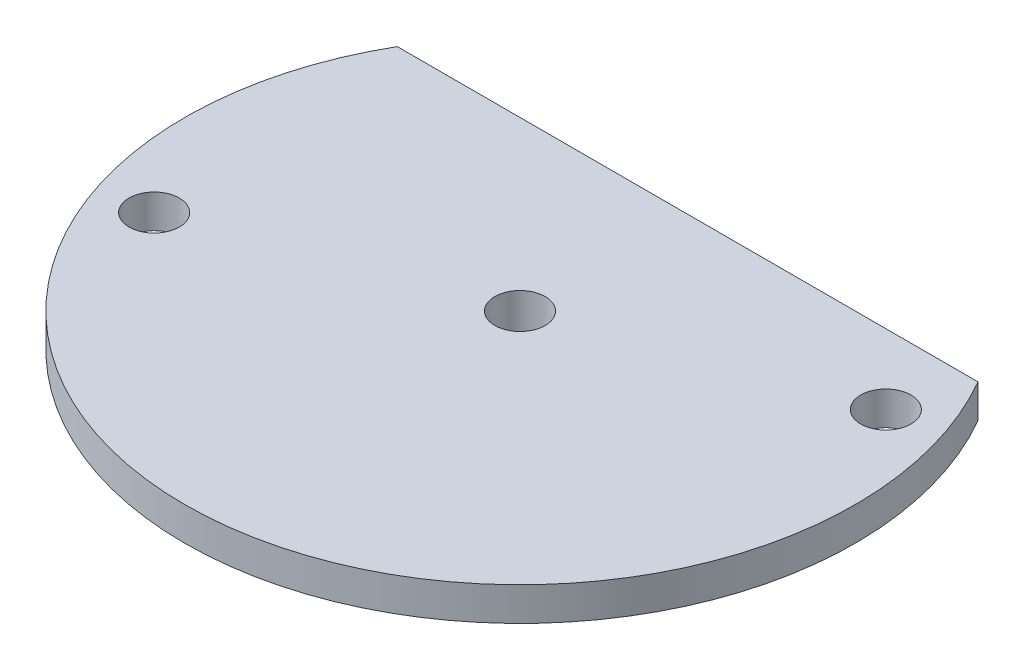
ISO-10303-21;
HEADER;
FILE_DESCRIPTION(('STEP AP214'),'2;1');
FILE_NAME('part.step','',(''),(''),'','','');
FILE_SCHEMA(('AUTOMOTIVE_DESIGN { 1 0 10303 214 1 1 1 1 }'));
ENDSEC;
DATA;
#1=APPLICATION_CONTEXT('core data for automotive mechanical design processes');
#2=APPLICATION_PROTOCOL_DEFINITION('international standard','automotive_design',2000,#1);
#3=PRODUCT_CONTEXT('',#1,'mechanical');
#4=PRODUCT('Part','Part','',(#3));
#5=PRODUCT_RELATED_PRODUCT_CATEGORY('part','',(#4));
#6=PRODUCT_DEFINITION_FORMATION('','',#4);
#7=PRODUCT_DEFINITION_CONTEXT('part definition',#1,'design');
#8=PRODUCT_DEFINITION('design','',#6,#7);
#9=PRODUCT_DEFINITION_SHAPE('','',#8);
#10=(LENGTH_UNIT() NAMED_UNIT(*) SI_UNIT(.MILLI.,.METRE.));
#11=(NAMED_UNIT(*) PLANE_ANGLE_UNIT() SI_UNIT($,.RADIAN.));
#12=(NAMED_UNIT(*) SI_UNIT($,.STERADIAN.) SOLID_ANGLE_UNIT());
#13=UNCERTAINTY_MEASURE_WITH_UNIT(LENGTH_MEASURE(1.E-05),#10,'distance_accuracy_value','');
#14=(GEOMETRIC_REPRESENTATION_CONTEXT(3) GLOBAL_UNCERTAINTY_ASSIGNED_CONTEXT((#13)) GLOBAL_UNIT_ASSIGNED_CONTEXT((#10,
#11,#12)) REPRESENTATION_CONTEXT('',''));
#15=CARTESIAN_POINT('',(0.,0.,0.));
#16=DIRECTION('',(0.,0.,1.));
#17=DIRECTION('',(1.,0.,0.));
#18=AXIS2_PLACEMENT_3D('',#15,#16,#17);
#19=CARTESIAN_POINT('',(0.,2.,0.));
#20=DIRECTION('',(0.,1.,0.));
#21=DIRECTION('',(0.,0.,1.));
#22=AXIS2_PLACEMENT_3D('',#19,#20,#21);
#23=PLANE('',#22);
#24=CARTESIAN_POINT('',(0.,2.,0.));
#25=DIRECTION('',(0.,1.,0.));
#26=DIRECTION('',(0.,0.,1.));
#27=AXIS2_PLACEMENT_3D('',#24,#25,#26);
#28=CIRCLE('',#27,1.5);
#29=CARTESIAN_POINT('',(0.,2.,1.5));
#30=VERTEX_POINT('',#29);
#31=EDGE_CURVE('E46',#30,#30,#28,.T.);
#32=ORIENTED_EDGE('',*,*,#31,.F.);
#33=EDGE_LOOP('',(#32));
#34=FACE_BOUND('',#33,.T.);
#35=CARTESIAN_POINT('',(-16.,2.,5.82352374825925));
#36=DIRECTION('',(0.,1.,0.));
#37=DIRECTION('',(0.,0.,1.));
#38=AXIS2_PLACEMENT_3D('',#35,#36,#37);
#39=CIRCLE('',#38,1.5);
#40=CARTESIAN_POINT('',(-16.,2.,7.32352374825925));
#41=VERTEX_POINT('',#40);
#42=EDGE_CURVE('E81',#41,#41,#39,.T.);
#43=ORIENTED_EDGE('',*,*,#42,.F.);
#44=EDGE_LOOP('',(#43));
#45=FACE_BOUND('',#44,.T.);
#46=CARTESIAN_POINT('',(0.,2.,0.));
#47=DIRECTION('',(0.,1.,0.));
#48=DIRECTION('',(0.,0.,1.));
#49=AXIS2_PLACEMENT_3D('',#46,#47,#48);
#50=CIRCLE('',#49,20.);
#51=CARTESIAN_POINT('',(-17.3205080756888,2.,-10.));
#52=VERTEX_POINT('',#51);
#53=CARTESIAN_POINT('',(17.3205080756888,2.,-10.));
#54=VERTEX_POINT('',#53);
#55=EDGE_CURVE('E74',#52,#54,#50,.T.);
#56=ORIENTED_EDGE('',*,*,#55,.T.);
#57=DIRECTION('',(-1.,0.,0.));
#58=VECTOR('',#57,1.);
#59=CARTESIAN_POINT('',(-17.3205080756888,2.,-10.));
#60=LINE('',#59,#58);
#61=EDGE_CURVE('E59',#54,#52,#60,.T.);
#62=ORIENTED_EDGE('',*,*,#61,.T.);
#63=EDGE_LOOP('',(#56,#62));
#64=FACE_BOUND('',#63,.T.);
#65=CARTESIAN_POINT('',(16.,2.,-5.82352374825925));
#66=DIRECTION('',(0.,1.,0.));
#67=DIRECTION('',(0.,0.,1.));
#68=AXIS2_PLACEMENT_3D('',#65,#66,#67);
#69=CIRCLE('',#68,1.5);
#70=CARTESIAN_POINT('',(16.,2.,-4.32352374825925));
#71=VERTEX_POINT('',#70);
#72=EDGE_CURVE('E90',#71,#71,#69,.T.);
#73=ORIENTED_EDGE('',*,*,#72,.F.);
#74=EDGE_LOOP('',(#73));
#75=FACE_BOUND('',#74,.T.);
#76=ADVANCED_FACE('F42',(#34,#45,#64,#75),#23,.T.);
#77=CARTESIAN_POINT('',(0.,0.,0.));
#78=DIRECTION('',(0.,1.,0.));
#79=DIRECTION('',(0.,0.,1.));
#80=AXIS2_PLACEMENT_3D('',#77,#78,#79);
#81=PLANE('',#80);
#82=CARTESIAN_POINT('',(0.,0.,0.));
#83=DIRECTION('',(0.,1.,0.));
#84=DIRECTION('',(0.,0.,1.));
#85=AXIS2_PLACEMENT_3D('',#82,#83,#84);
#86=CIRCLE('',#85,3.);
#87=CARTESIAN_POINT('',(0.,0.,3.));
#88=VERTEX_POINT('',#87);
#89=EDGE_CURVE('E98',#88,#88,#86,.T.);
#90=ORIENTED_EDGE('',*,*,#89,.T.);
#91=EDGE_LOOP('',(#90));
#92=FACE_BOUND('',#91,.T.);
#93=CARTESIAN_POINT('',(0.,0.,0.));
#94=DIRECTION('',(0.,1.,0.));
#95=DIRECTION('',(0.,0.,1.));
#96=AXIS2_PLACEMENT_3D('',#93,#94,#95);
#97=CIRCLE('',#96,20.);
#98=CARTESIAN_POINT('',(-17.3205080756888,0.,-10.));
#99=VERTEX_POINT('',#98);
#100=CARTESIAN_POINT('',(17.3205080756888,0.,-10.));
#101=VERTEX_POINT('',#100);
#102=EDGE_CURVE('E75',#99,#101,#97,.T.);
#103=ORIENTED_EDGE('',*,*,#102,.F.);
#104=DIRECTION('',(-1.,0.,0.));
#105=VECTOR('',#104,1.);
#106=CARTESIAN_POINT('',(-17.3205080756888,0.,-10.));
#107=LINE('',#106,#105);
#108=EDGE_CURVE('E67',#101,#99,#107,.T.);
#109=ORIENTED_EDGE('',*,*,#108,.F.);
#110=EDGE_LOOP('',(#103,#109));
#111=FACE_BOUND('',#110,.T.);
#112=CARTESIAN_POINT('',(-16.,0.,5.82352374825925));
#113=DIRECTION('',(0.,1.,0.));
#114=DIRECTION('',(0.,0.,1.));
#115=AXIS2_PLACEMENT_3D('',#112,#113,#114);
#116=CIRCLE('',#115,1.5);
#117=CARTESIAN_POINT('',(-16.,0.,7.32352374825925));
#118=VERTEX_POINT('',#117);
#119=EDGE_CURVE('E84',#118,#118,#116,.T.);
#120=ORIENTED_EDGE('',*,*,#119,.T.);
#121=EDGE_LOOP('',(#120));
#122=FACE_BOUND('',#121,.T.);
#123=CARTESIAN_POINT('',(16.,0.,-5.82352374825925));
#124=DIRECTION('',(0.,1.,0.));
#125=DIRECTION('',(0.,0.,1.));
#126=AXIS2_PLACEMENT_3D('',#123,#124,#125);
#127=CIRCLE('',#126,1.5);
#128=CARTESIAN_POINT('',(16.,0.,-4.32352374825925));
#129=VERTEX_POINT('',#128);
#130=EDGE_CURVE('E92',#129,#129,#127,.T.);
#131=ORIENTED_EDGE('',*,*,#130,.T.);
#132=EDGE_LOOP('',(#131));
#133=FACE_BOUND('',#132,.T.);
#134=ADVANCED_FACE('F79',(#92,#111,#122,#133),#81,.F.);
#135=CARTESIAN_POINT('',(0.,2.,0.));
#136=DIRECTION('',(0.,-1.,0.));
#137=DIRECTION('',(0.,0.,-1.));
#138=AXIS2_PLACEMENT_3D('',#135,#136,#137);
#139=CYLINDRICAL_SURFACE('',#138,20.);
#140=ORIENTED_EDGE('',*,*,#102,.T.);
#141=DIRECTION('',(0.,-1.,0.));
#142=VECTOR('',#141,1.);
#143=CARTESIAN_POINT('',(17.3205080756888,2.,-10.));
#144=LINE('',#143,#142);
#145=EDGE_CURVE('E12',#54,#101,#144,.T.);
#146=ORIENTED_EDGE('',*,*,#145,.F.);
#147=ORIENTED_EDGE('',*,*,#55,.F.);
#148=DIRECTION('',(0.,-1.,0.));
#149=VECTOR('',#148,1.);
#150=CARTESIAN_POINT('',(-17.3205080756888,2.,-10.));
#151=LINE('',#150,#149);
#152=EDGE_CURVE('E52',#52,#99,#151,.T.);
#153=ORIENTED_EDGE('',*,*,#152,.T.);
#154=EDGE_LOOP('',(#140,#146,#147,#153));
#155=FACE_BOUND('',#154,.T.);
#156=ADVANCED_FACE('F44',(#155),#139,.T.);
#157=CARTESIAN_POINT('',(-17.3205080756888,2.,-10.));
#158=DIRECTION('',(0.,0.,1.));
#159=DIRECTION('',(1.,0.,0.));
#160=AXIS2_PLACEMENT_3D('',#157,#158,#159);
#161=PLANE('',#160);
#162=ORIENTED_EDGE('',*,*,#108,.T.);
#163=ORIENTED_EDGE('',*,*,#152,.F.);
#164=ORIENTED_EDGE('',*,*,#61,.F.);
#165=ORIENTED_EDGE('',*,*,#145,.T.);
#166=EDGE_LOOP('',(#162,#163,#164,#165));
#167=FACE_BOUND('',#166,.T.);
#168=ADVANCED_FACE('F70',(#167),#161,.F.);
#169=CARTESIAN_POINT('',(-16.,2.,5.82352374825925));
#170=DIRECTION('',(0.,-1.,0.));
#171=DIRECTION('',(0.,0.,-1.));
#172=AXIS2_PLACEMENT_3D('',#169,#170,#171);
#173=CYLINDRICAL_SURFACE('',#172,1.5);
#174=ORIENTED_EDGE('',*,*,#42,.T.);
#175=EDGE_LOOP('',(#174));
#176=FACE_BOUND('',#175,.T.);
#177=ORIENTED_EDGE('',*,*,#119,.F.);
#178=EDGE_LOOP('',(#177));
#179=FACE_BOUND('',#178,.T.);
#180=ADVANCED_FACE('F123',(#176,#179),#173,.F.);
#181=CARTESIAN_POINT('',(16.,2.,-5.82352374825925));
#182=DIRECTION('',(0.,-1.,0.));
#183=DIRECTION('',(0.,0.,-1.));
#184=AXIS2_PLACEMENT_3D('',#181,#182,#183);
#185=CYLINDRICAL_SURFACE('',#184,1.5);
#186=ORIENTED_EDGE('',*,*,#72,.T.);
#187=EDGE_LOOP('',(#186));
#188=FACE_BOUND('',#187,.T.);
#189=ORIENTED_EDGE('',*,*,#130,.F.);
#190=EDGE_LOOP('',(#189));
#191=FACE_BOUND('',#190,.T.);
#192=ADVANCED_FACE('F119',(#188,#191),#185,.F.);
#193=CARTESIAN_POINT('',(0.,-6.,0.));
#194=DIRECTION('',(0.,1.,0.));
#195=DIRECTION('',(0.,0.,1.));
#196=AXIS2_PLACEMENT_3D('',#193,#194,#195);
#197=CYLINDRICAL_SURFACE('',#196,3.);
#198=CARTESIAN_POINT('',(0.,-6.,0.));
#199=DIRECTION('',(0.,1.,0.));
#200=DIRECTION('',(0.,0.,1.));
#201=AXIS2_PLACEMENT_3D('',#198,#199,#200);
#202=CIRCLE('',#201,3.);
#203=CARTESIAN_POINT('',(0.,-6.,3.));
#204=VERTEX_POINT('',#203);
#205=EDGE_CURVE('E95',#204,#204,#202,.T.);
#206=ORIENTED_EDGE('',*,*,#205,.T.);
#207=EDGE_LOOP('',(#206));
#208=FACE_BOUND('',#207,.T.);
#209=ORIENTED_EDGE('',*,*,#89,.F.);
#210=EDGE_LOOP('',(#209));
#211=FACE_BOUND('',#210,.T.);
#212=ADVANCED_FACE('F122',(#208,#211),#197,.T.);
#213=CARTESIAN_POINT('',(0.,-6.,0.));
#214=DIRECTION('',(0.,1.,0.));
#215=DIRECTION('',(0.,0.,1.));
#216=AXIS2_PLACEMENT_3D('',#213,#214,#215);
#217=PLANE('',#216);
#218=CARTESIAN_POINT('',(0.,-6.,0.));
#219=DIRECTION('',(0.,1.,0.));
#220=DIRECTION('',(0.,0.,1.));
#221=AXIS2_PLACEMENT_3D('',#218,#219,#220);
#222=CIRCLE('',#221,1.5);
#223=CARTESIAN_POINT('',(0.,-6.,1.5));
#224=VERTEX_POINT('',#223);
#225=EDGE_CURVE('E101',#224,#224,#222,.T.);
#226=ORIENTED_EDGE('',*,*,#225,.T.);
#227=EDGE_LOOP('',(#226));
#228=FACE_BOUND('',#227,.T.);
#229=ORIENTED_EDGE('',*,*,#205,.F.);
#230=EDGE_LOOP('',(#229));
#231=FACE_BOUND('',#230,.T.);
#232=ADVANCED_FACE('F145',(#228,#231),#217,.F.);
#233=CARTESIAN_POINT('',(0.,-6.,0.));
#234=DIRECTION('',(0.,1.,0.));
#235=DIRECTION('',(0.,0.,1.));
#236=AXIS2_PLACEMENT_3D('',#233,#234,#235);
#237=CYLINDRICAL_SURFACE('',#236,1.5);
#238=ORIENTED_EDGE('',*,*,#225,.F.);
#239=EDGE_LOOP('',(#238));
#240=FACE_BOUND('',#239,.T.);
#241=ORIENTED_EDGE('',*,*,#31,.T.);
#242=EDGE_LOOP('',(#241));
#243=FACE_BOUND('',#242,.T.);
#244=ADVANCED_FACE('F110',(#240,#243),#237,.F.);
#245=CLOSED_SHELL('',(#76,#134,#156,#168,#180,#192,#212,#232,#244));
#246=MANIFOLD_SOLID_BREP('B2',#245);
#247=ADVANCED_BREP_SHAPE_REPRESENTATION('',(#18,#246),#14);
#248=SHAPE_DEFINITION_REPRESENTATION(#9,#247);
ENDSEC;
END-ISO-10303-21;
